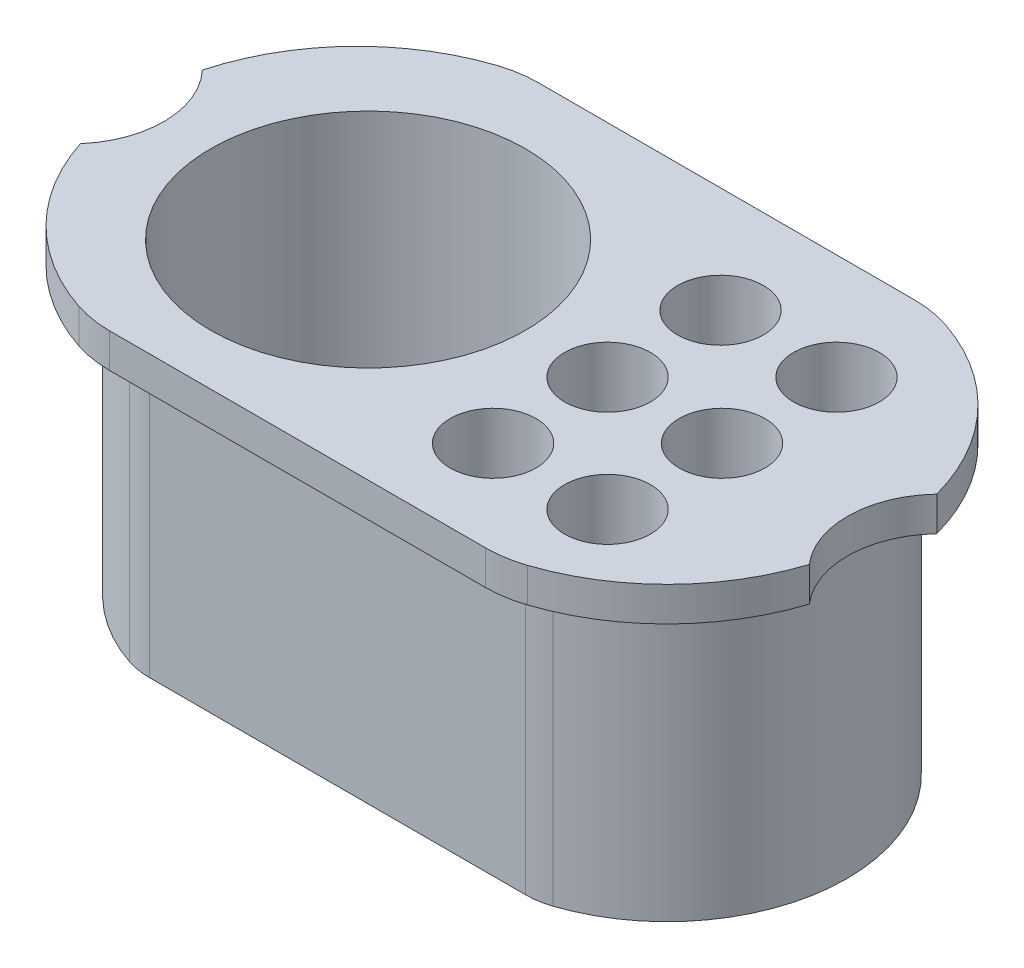
ISO-10303-21;
HEADER;
FILE_DESCRIPTION(('STEP AP214'),'2;1');
FILE_NAME('part.step','',(''),(''),'','','');
FILE_SCHEMA(('AUTOMOTIVE_DESIGN { 1 0 10303 214 1 1 1 1 }'));
ENDSEC;
DATA;
#1=APPLICATION_CONTEXT('core data for automotive mechanical design processes');
#2=APPLICATION_PROTOCOL_DEFINITION('international standard','automotive_design',2000,#1);
#3=PRODUCT_CONTEXT('',#1,'mechanical');
#4=PRODUCT('Part','Part','',(#3));
#5=PRODUCT_RELATED_PRODUCT_CATEGORY('part','',(#4));
#6=PRODUCT_DEFINITION_FORMATION('','',#4);
#7=PRODUCT_DEFINITION_CONTEXT('part definition',#1,'design');
#8=PRODUCT_DEFINITION('design','',#6,#7);
#9=PRODUCT_DEFINITION_SHAPE('','',#8);
#10=(LENGTH_UNIT() NAMED_UNIT(*) SI_UNIT(.MILLI.,.METRE.));
#11=(NAMED_UNIT(*) PLANE_ANGLE_UNIT() SI_UNIT($,.RADIAN.));
#12=(NAMED_UNIT(*) SI_UNIT($,.STERADIAN.) SOLID_ANGLE_UNIT());
#13=UNCERTAINTY_MEASURE_WITH_UNIT(LENGTH_MEASURE(1.E-05),#10,'distance_accuracy_value','');
#14=(GEOMETRIC_REPRESENTATION_CONTEXT(3) GLOBAL_UNCERTAINTY_ASSIGNED_CONTEXT((#13)) GLOBAL_UNIT_ASSIGNED_CONTEXT((#10,
#11,#12)) REPRESENTATION_CONTEXT('',''));
#15=CARTESIAN_POINT('',(0.,0.,0.));
#16=DIRECTION('',(0.,0.,1.));
#17=DIRECTION('',(1.,0.,0.));
#18=AXIS2_PLACEMENT_3D('',#15,#16,#17);
#19=CARTESIAN_POINT('',(-28.0219830583856,6.,-1.10913174767152));
#20=DIRECTION('',(0.,-1.,0.));
#21=DIRECTION('',(0.,0.,-1.));
#22=AXIS2_PLACEMENT_3D('',#19,#20,#21);
#23=CYLINDRICAL_SURFACE('',#22,38.4375);
#24=DIRECTION('',(0.,-1.,0.));
#25=VECTOR('',#24,1.);
#26=CARTESIAN_POINT('',(-65.1201453529565,5.,-11.1673503084143));
#27=LINE('',#26,#25);
#28=CARTESIAN_POINT('',(-65.1201453529565,6.,-11.1673503084143));
#29=VERTEX_POINT('',#28);
#30=CARTESIAN_POINT('',(-65.1201453529565,0.,-11.1673503084143));
#31=VERTEX_POINT('',#30);
#32=EDGE_CURVE('E450',#29,#31,#27,.T.);
#33=ORIENTED_EDGE('',*,*,#32,.F.);
#34=CARTESIAN_POINT('',(-28.0219830583856,6.,-1.10913174767152));
#35=DIRECTION('',(0.,1.,0.));
#36=DIRECTION('',(0.,0.,1.));
#37=AXIS2_PLACEMENT_3D('',#34,#35,#36);
#38=CIRCLE('',#37,38.4375);
#39=CARTESIAN_POINT('',(-40.1227436589354,6.,-37.5921825951292));
#40=VERTEX_POINT('',#39);
#41=EDGE_CURVE('E273',#40,#29,#38,.T.);
#42=ORIENTED_EDGE('',*,*,#41,.F.);
#43=DIRECTION('',(0.,-1.,0.));
#44=VECTOR('',#43,1.);
#45=CARTESIAN_POINT('',(-40.1227436589354,6.,-37.5921825951292));
#46=LINE('',#45,#44);
#47=CARTESIAN_POINT('',(-40.1227436589354,0.,-37.5921825951292));
#48=VERTEX_POINT('',#47);
#49=EDGE_CURVE('E242',#40,#48,#46,.T.);
#50=ORIENTED_EDGE('',*,*,#49,.T.);
#51=CARTESIAN_POINT('',(-28.0219830583856,0.,-1.10913174767152));
#52=DIRECTION('',(0.,1.,0.));
#53=DIRECTION('',(0.,0.,1.));
#54=AXIS2_PLACEMENT_3D('',#51,#52,#53);
#55=CIRCLE('',#54,38.4375);
#56=EDGE_CURVE('E260',#48,#31,#55,.T.);
#57=ORIENTED_EDGE('',*,*,#56,.T.);
#58=EDGE_LOOP('',(#33,#42,#50,#57));
#59=FACE_BOUND('',#58,.T.);
#60=ADVANCED_FACE('F33',(#59),#23,.T.);
#61=DIRECTION('',(0.,-1.,0.));
#62=VECTOR('',#61,1.);
#63=CARTESIAN_POINT('',(-64.6259224052166,5.,10.6208738168417));
#64=LINE('',#63,#62);
#65=CARTESIAN_POINT('',(-64.6259224052166,0.,10.6208738168417));
#66=VERTEX_POINT('',#65);
#67=CARTESIAN_POINT('',(-64.6259224052166,6.,10.6208738168417));
#68=VERTEX_POINT('',#67);
#69=EDGE_CURVE('E52',#66,#68,#64,.F.);
#70=ORIENTED_EDGE('',*,*,#69,.F.);
#71=CARTESIAN_POINT('',(-40.1227436589354,0.,35.3739190997861));
#72=VERTEX_POINT('',#71);
#73=EDGE_CURVE('E263',#66,#72,#55,.T.);
#74=ORIENTED_EDGE('',*,*,#73,.T.);
#75=DIRECTION('',(0.,-1.,0.));
#76=VECTOR('',#75,1.);
#77=CARTESIAN_POINT('',(-40.1227436589354,6.,35.3739190997861));
#78=LINE('',#77,#76);
#79=CARTESIAN_POINT('',(-40.1227436589354,6.,35.3739190997861));
#80=VERTEX_POINT('',#79);
#81=EDGE_CURVE('E245',#72,#80,#78,.F.);
#82=ORIENTED_EDGE('',*,*,#81,.T.);
#83=EDGE_CURVE('E252',#68,#80,#38,.T.);
#84=ORIENTED_EDGE('',*,*,#83,.F.);
#85=EDGE_LOOP('',(#70,#74,#82,#84));
#86=FACE_BOUND('',#85,.T.);
#87=ADVANCED_FACE('F567',(#86),#23,.T.);
#88=CARTESIAN_POINT('',(26.1030169416145,6.,-1.10913174767152));
#89=DIRECTION('',(0.,-1.,0.));
#90=DIRECTION('',(0.,0.,-1.));
#91=AXIS2_PLACEMENT_3D('',#88,#89,#90);
#92=CYLINDRICAL_SURFACE('',#91,38.4375);
#93=DIRECTION('',(0.,-1.,0.));
#94=VECTOR('',#93,1.);
#95=CARTESIAN_POINT('',(62.7069562884455,5.,10.6208738168417));
#96=LINE('',#95,#94);
#97=CARTESIAN_POINT('',(62.7069562884455,6.,10.6208738168417));
#98=VERTEX_POINT('',#97);
#99=CARTESIAN_POINT('',(62.7069562884455,0.,10.6208738168417));
#100=VERTEX_POINT('',#99);
#101=EDGE_CURVE('E443',#98,#100,#96,.T.);
#102=ORIENTED_EDGE('',*,*,#101,.F.);
#103=CARTESIAN_POINT('',(26.1030169416145,6.,-1.10913174767152));
#104=DIRECTION('',(0.,1.,0.));
#105=DIRECTION('',(0.,0.,-1.));
#106=AXIS2_PLACEMENT_3D('',#103,#104,#105);
#107=CIRCLE('',#106,38.4375);
#108=CARTESIAN_POINT('',(38.2037775421643,6.,35.3739190997861));
#109=VERTEX_POINT('',#108);
#110=EDGE_CURVE('E266',#109,#98,#107,.T.);
#111=ORIENTED_EDGE('',*,*,#110,.F.);
#112=DIRECTION('',(0.,-1.,0.));
#113=VECTOR('',#112,1.);
#114=CARTESIAN_POINT('',(38.2037775421643,6.,35.3739190997861));
#115=LINE('',#114,#113);
#116=CARTESIAN_POINT('',(38.2037775421643,0.,35.3739190997861));
#117=VERTEX_POINT('',#116);
#118=EDGE_CURVE('E208',#109,#117,#115,.T.);
#119=ORIENTED_EDGE('',*,*,#118,.T.);
#120=CARTESIAN_POINT('',(26.1030169416145,0.,-1.10913174767152));
#121=DIRECTION('',(0.,1.,0.));
#122=DIRECTION('',(0.,0.,-1.));
#123=AXIS2_PLACEMENT_3D('',#120,#121,#122);
#124=CIRCLE('',#123,38.4375);
#125=EDGE_CURVE('E253',#117,#100,#124,.T.);
#126=ORIENTED_EDGE('',*,*,#125,.T.);
#127=EDGE_LOOP('',(#102,#111,#119,#126));
#128=FACE_BOUND('',#127,.T.);
#129=ADVANCED_FACE('F550',(#128),#92,.T.);
#130=DIRECTION('',(0.,-1.,0.));
#131=VECTOR('',#130,1.);
#132=CARTESIAN_POINT('',(63.2011792361854,5.,-11.1673503084143));
#133=LINE('',#132,#131);
#134=CARTESIAN_POINT('',(63.2011792361854,0.,-11.1673503084143));
#135=VERTEX_POINT('',#134);
#136=CARTESIAN_POINT('',(63.2011792361854,6.,-11.1673503084143));
#137=VERTEX_POINT('',#136);
#138=EDGE_CURVE('E59',#135,#137,#133,.F.);
#139=ORIENTED_EDGE('',*,*,#138,.F.);
#140=CARTESIAN_POINT('',(38.2037775421643,0.,-37.5921825951292));
#141=VERTEX_POINT('',#140);
#142=EDGE_CURVE('E256',#135,#141,#124,.T.);
#143=ORIENTED_EDGE('',*,*,#142,.T.);
#144=DIRECTION('',(0.,-1.,0.));
#145=VECTOR('',#144,1.);
#146=CARTESIAN_POINT('',(38.2037775421643,6.,-37.5921825951292));
#147=LINE('',#146,#145);
#148=CARTESIAN_POINT('',(38.2037775421643,6.,-37.5921825951292));
#149=VERTEX_POINT('',#148);
#150=EDGE_CURVE('E211',#141,#149,#147,.F.);
#151=ORIENTED_EDGE('',*,*,#150,.T.);
#152=EDGE_CURVE('E269',#137,#149,#107,.T.);
#153=ORIENTED_EDGE('',*,*,#152,.F.);
#154=EDGE_LOOP('',(#139,#143,#151,#153));
#155=FACE_BOUND('',#154,.T.);
#156=ADVANCED_FACE('F545',(#155),#92,.T.);
#157=CARTESIAN_POINT('',(-28.0219830583856,0.,-1.10913174767152));
#158=DIRECTION('',(0.,1.,0.));
#159=DIRECTION('',(0.,0.,1.));
#160=AXIS2_PLACEMENT_3D('',#157,#158,#159);
#161=PLANE('',#160);
#162=CARTESIAN_POINT('',(-76.9189661167711,0.,0.));
#163=DIRECTION('',(0.,1.,0.));
#164=DIRECTION('',(0.,0.,-1.));
#165=AXIS2_PLACEMENT_3D('',#162,#163,#164);
#166=CIRCLE('',#165,16.2456727877753);
#167=EDGE_CURVE('E453',#66,#31,#166,.T.);
#168=ORIENTED_EDGE('',*,*,#167,.T.);
#169=ORIENTED_EDGE('',*,*,#56,.F.);
#170=CARTESIAN_POINT('',(-33.8264129399501,0.,-18.6091317476715));
#171=DIRECTION('',(0.,1.,0.));
#172=DIRECTION('',(0.,0.,1.));
#173=AXIS2_PLACEMENT_3D('',#170,#171,#172);
#174=CIRCLE('',#173,20.);
#175=CARTESIAN_POINT('',(-33.8264129399502,0.,-38.6091317476715));
#176=VERTEX_POINT('',#175);
#177=EDGE_CURVE('E232',#48,#176,#174,.F.);
#178=ORIENTED_EDGE('',*,*,#177,.T.);
#179=DIRECTION('',(-1.,0.,0.));
#180=VECTOR('',#179,1.);
#181=CARTESIAN_POINT('',(34.5405169416144,0.,-38.6091317476715));
#182=LINE('',#181,#180);
#183=CARTESIAN_POINT('',(31.907446823179,0.,-38.6091317476715));
#184=VERTEX_POINT('',#183);
#185=EDGE_CURVE('E249',#184,#176,#182,.T.);
#186=ORIENTED_EDGE('',*,*,#185,.F.);
#187=CARTESIAN_POINT('',(31.907446823179,0.,-18.6091317476715));
#188=DIRECTION('',(0.,1.,0.));
#189=DIRECTION('',(0.,0.,1.));
#190=AXIS2_PLACEMENT_3D('',#187,#188,#189);
#191=CIRCLE('',#190,20.);
#192=EDGE_CURVE('E239',#184,#141,#191,.F.);
#193=ORIENTED_EDGE('',*,*,#192,.T.);
#194=ORIENTED_EDGE('',*,*,#142,.F.);
#195=CARTESIAN_POINT('',(75.,0.,0.));
#196=DIRECTION('',(0.,1.,0.));
#197=DIRECTION('',(0.,0.,1.));
#198=AXIS2_PLACEMENT_3D('',#195,#196,#197);
#199=CIRCLE('',#198,16.2456727877753);
#200=EDGE_CURVE('E447',#135,#100,#199,.T.);
#201=ORIENTED_EDGE('',*,*,#200,.T.);
#202=ORIENTED_EDGE('',*,*,#125,.F.);
#203=CARTESIAN_POINT('',(31.907446823179,0.,16.3908682523285));
#204=DIRECTION('',(0.,1.,0.));
#205=DIRECTION('',(0.,0.,1.));
#206=AXIS2_PLACEMENT_3D('',#203,#204,#205);
#207=CIRCLE('',#206,20.);
#208=CARTESIAN_POINT('',(31.907446823179,0.,36.3908682523285));
#209=VERTEX_POINT('',#208);
#210=EDGE_CURVE('E237',#117,#209,#207,.F.);
#211=ORIENTED_EDGE('',*,*,#210,.T.);
#212=DIRECTION('',(1.,0.,0.));
#213=VECTOR('',#212,1.);
#214=CARTESIAN_POINT('',(34.5405169416144,0.,36.3908682523285));
#215=LINE('',#214,#213);
#216=CARTESIAN_POINT('',(-33.8264129399501,0.,36.3908682523285));
#217=VERTEX_POINT('',#216);
#218=EDGE_CURVE('E257',#217,#209,#215,.T.);
#219=ORIENTED_EDGE('',*,*,#218,.F.);
#220=CARTESIAN_POINT('',(-33.8264129399501,0.,16.3908682523285));
#221=DIRECTION('',(0.,1.,0.));
#222=DIRECTION('',(0.,0.,1.));
#223=AXIS2_PLACEMENT_3D('',#220,#221,#222);
#224=CIRCLE('',#223,20.);
#225=EDGE_CURVE('E234',#217,#72,#224,.F.);
#226=ORIENTED_EDGE('',*,*,#225,.T.);
#227=ORIENTED_EDGE('',*,*,#73,.F.);
#228=EDGE_LOOP('',(#168,#169,#178,#186,#193,#194,#201,#202,#211,#219,#226,#227));
#229=FACE_BOUND('',#228,.T.);
#230=CARTESIAN_POINT('',(31.907446823179,0.,-18.6091317476715));
#231=DIRECTION('',(0.,1.,0.));
#232=DIRECTION('',(0.,0.,1.));
#233=AXIS2_PLACEMENT_3D('',#230,#231,#232);
#234=CIRCLE('',#233,13.);
#235=CARTESIAN_POINT('',(36.0000617905195,0.,-30.948114798519));
#236=VERTEX_POINT('',#235);
#237=CARTESIAN_POINT('',(31.9074468231791,0.,-31.6091317476715));
#238=VERTEX_POINT('',#237);
#239=EDGE_CURVE('E204',#236,#238,#234,.T.);
#240=ORIENTED_EDGE('',*,*,#239,.T.);
#241=DIRECTION('',(1.,0.,0.));
#242=VECTOR('',#241,1.);
#243=CARTESIAN_POINT('',(-33.8264129399501,0.,-31.6091317476715));
#244=LINE('',#243,#242);
#245=CARTESIAN_POINT('',(-33.8264129399501,0.,-31.6091317476715));
#246=VERTEX_POINT('',#245);
#247=EDGE_CURVE('E278',#246,#238,#244,.T.);
#248=ORIENTED_EDGE('',*,*,#247,.F.);
#249=CARTESIAN_POINT('',(-33.8264129399501,0.,-18.6091317476715));
#250=DIRECTION('',(0.,1.,0.));
#251=DIRECTION('',(0.,0.,1.));
#252=AXIS2_PLACEMENT_3D('',#249,#250,#251);
#253=CIRCLE('',#252,13.);
#254=CARTESIAN_POINT('',(-37.9190279072906,0.,-30.948114798519));
#255=VERTEX_POINT('',#254);
#256=EDGE_CURVE('E367',#246,#255,#253,.T.);
#257=ORIENTED_EDGE('',*,*,#256,.T.);
#258=CARTESIAN_POINT('',(-28.0219830583856,0.,-1.10913174767152));
#259=DIRECTION('',(0.,1.,0.));
#260=DIRECTION('',(0.,0.,1.));
#261=AXIS2_PLACEMENT_3D('',#258,#259,#260);
#262=CIRCLE('',#261,31.4375);
#263=CARTESIAN_POINT('',(-37.9190279072906,0.,28.7298513031759));
#264=VERTEX_POINT('',#263);
#265=EDGE_CURVE('E381',#255,#264,#262,.T.);
#266=ORIENTED_EDGE('',*,*,#265,.T.);
#267=CARTESIAN_POINT('',(-33.8264129399501,0.,16.3908682523285));
#268=DIRECTION('',(0.,1.,0.));
#269=DIRECTION('',(0.,0.,1.));
#270=AXIS2_PLACEMENT_3D('',#267,#268,#269);
#271=CIRCLE('',#270,13.);
#272=CARTESIAN_POINT('',(-33.8264129399502,0.,29.3908682523285));
#273=VERTEX_POINT('',#272);
#274=EDGE_CURVE('E393',#264,#273,#271,.T.);
#275=ORIENTED_EDGE('',*,*,#274,.T.);
#276=DIRECTION('',(1.,0.,0.));
#277=VECTOR('',#276,1.);
#278=CARTESIAN_POINT('',(-33.8264129399502,0.,29.3908682523285));
#279=LINE('',#278,#277);
#280=CARTESIAN_POINT('',(31.907446823179,0.,29.3908682523285));
#281=VERTEX_POINT('',#280);
#282=EDGE_CURVE('E405',#273,#281,#279,.T.);
#283=ORIENTED_EDGE('',*,*,#282,.T.);
#284=CARTESIAN_POINT('',(31.907446823179,0.,16.3908682523285));
#285=DIRECTION('',(0.,1.,0.));
#286=DIRECTION('',(0.,0.,1.));
#287=AXIS2_PLACEMENT_3D('',#284,#285,#286);
#288=CIRCLE('',#287,13.);
#289=CARTESIAN_POINT('',(36.0000617905195,0.,28.7298513031759));
#290=VERTEX_POINT('',#289);
#291=EDGE_CURVE('E417',#281,#290,#288,.T.);
#292=ORIENTED_EDGE('',*,*,#291,.T.);
#293=CARTESIAN_POINT('',(26.1030169416145,0.,-1.10913174767152));
#294=DIRECTION('',(0.,1.,0.));
#295=DIRECTION('',(0.,0.,1.));
#296=AXIS2_PLACEMENT_3D('',#293,#294,#295);
#297=CIRCLE('',#296,31.4375);
#298=EDGE_CURVE('E429',#290,#236,#297,.T.);
#299=ORIENTED_EDGE('',*,*,#298,.T.);
#300=EDGE_LOOP('',(#240,#248,#257,#266,#275,#283,#292,#299));
#301=FACE_BOUND('',#300,.T.);
#302=ADVANCED_FACE('F439',(#229,#301),#161,.F.);
#303=CARTESIAN_POINT('',(34.5405169416144,6.,36.3908682523285));
#304=DIRECTION('',(0.,0.,-1.));
#305=DIRECTION('',(-1.,0.,0.));
#306=AXIS2_PLACEMENT_3D('',#303,#304,#305);
#307=PLANE('',#306);
#308=DIRECTION('',(1.,0.,0.));
#309=VECTOR('',#308,1.);
#310=CARTESIAN_POINT('',(34.5405169416144,6.,36.3908682523285));
#311=LINE('',#310,#309);
#312=CARTESIAN_POINT('',(-33.8264129399501,6.,36.3908682523285));
#313=VERTEX_POINT('',#312);
#314=CARTESIAN_POINT('',(31.907446823179,6.,36.3908682523285));
#315=VERTEX_POINT('',#314);
#316=EDGE_CURVE('E270',#313,#315,#311,.T.);
#317=ORIENTED_EDGE('',*,*,#316,.F.);
#318=DIRECTION('',(0.,-1.,0.));
#319=VECTOR('',#318,1.);
#320=CARTESIAN_POINT('',(-33.8264129399501,6.,36.3908682523285));
#321=LINE('',#320,#319);
#322=EDGE_CURVE('E214',#313,#217,#321,.T.);
#323=ORIENTED_EDGE('',*,*,#322,.T.);
#324=ORIENTED_EDGE('',*,*,#218,.T.);
#325=DIRECTION('',(0.,-1.,0.));
#326=VECTOR('',#325,1.);
#327=CARTESIAN_POINT('',(31.907446823179,6.,36.3908682523285));
#328=LINE('',#327,#326);
#329=EDGE_CURVE('E217',#209,#315,#328,.F.);
#330=ORIENTED_EDGE('',*,*,#329,.T.);
#331=EDGE_LOOP('',(#317,#323,#324,#330));
#332=FACE_BOUND('',#331,.T.);
#333=ADVANCED_FACE('F557',(#332),#307,.F.);
#334=CARTESIAN_POINT('',(34.5405169416144,6.,-38.6091317476715));
#335=DIRECTION('',(0.,0.,1.));
#336=DIRECTION('',(1.,0.,0.));
#337=AXIS2_PLACEMENT_3D('',#334,#335,#336);
#338=PLANE('',#337);
#339=ORIENTED_EDGE('',*,*,#185,.T.);
#340=DIRECTION('',(0.,-1.,0.));
#341=VECTOR('',#340,1.);
#342=CARTESIAN_POINT('',(-33.8264129399502,6.,-38.6091317476715));
#343=LINE('',#342,#341);
#344=CARTESIAN_POINT('',(-33.8264129399502,6.,-38.6091317476715));
#345=VERTEX_POINT('',#344);
#346=EDGE_CURVE('E227',#176,#345,#343,.F.);
#347=ORIENTED_EDGE('',*,*,#346,.T.);
#348=DIRECTION('',(-1.,0.,0.));
#349=VECTOR('',#348,1.);
#350=CARTESIAN_POINT('',(34.5405169416144,6.,-38.6091317476715));
#351=LINE('',#350,#349);
#352=CARTESIAN_POINT('',(31.907446823179,6.,-38.6091317476715));
#353=VERTEX_POINT('',#352);
#354=EDGE_CURVE('E248',#353,#345,#351,.T.);
#355=ORIENTED_EDGE('',*,*,#354,.F.);
#356=DIRECTION('',(0.,-1.,0.));
#357=VECTOR('',#356,1.);
#358=CARTESIAN_POINT('',(31.907446823179,6.,-38.6091317476715));
#359=LINE('',#358,#357);
#360=EDGE_CURVE('E229',#353,#184,#359,.T.);
#361=ORIENTED_EDGE('',*,*,#360,.T.);
#362=EDGE_LOOP('',(#339,#347,#355,#361));
#363=FACE_BOUND('',#362,.T.);
#364=ADVANCED_FACE('F512',(#363),#338,.F.);
#365=CARTESIAN_POINT('',(-28.0219830583856,6.,-1.10913174767152));
#366=DIRECTION('',(0.,1.,0.));
#367=DIRECTION('',(0.,0.,1.));
#368=AXIS2_PLACEMENT_3D('',#365,#366,#367);
#369=PLANE('',#368);
#370=CARTESIAN_POINT('',(36.7481952476588,6.,-20.0933036744728));
#371=DIRECTION('',(0.,1.,0.));
#372=DIRECTION('',(0.,0.,1.));
#373=AXIS2_PLACEMENT_3D('',#370,#371,#372);
#374=CIRCLE('',#373,7.5);
#375=CARTESIAN_POINT('',(36.7481952476588,6.,-12.5933036744728));
#376=VERTEX_POINT('',#375);
#377=EDGE_CURVE('E493',#376,#376,#374,.T.);
#378=ORIENTED_EDGE('',*,*,#377,.F.);
#379=EDGE_LOOP('',(#378));
#380=FACE_BOUND('',#379,.T.);
#381=CARTESIAN_POINT('',(36.7481952476588,6.,19.9066963255272));
#382=DIRECTION('',(0.,1.,0.));
#383=DIRECTION('',(0.,0.,1.));
#384=AXIS2_PLACEMENT_3D('',#381,#382,#383);
#385=CIRCLE('',#384,7.5);
#386=CARTESIAN_POINT('',(36.7481952476588,6.,27.4066963255272));
#387=VERTEX_POINT('',#386);
#388=EDGE_CURVE('E487',#387,#387,#385,.T.);
#389=ORIENTED_EDGE('',*,*,#388,.F.);
#390=EDGE_LOOP('',(#389));
#391=FACE_BOUND('',#390,.T.);
#392=CARTESIAN_POINT('',(16.4862682542421,6.,-20.0915884571765));
#393=DIRECTION('',(0.,1.,0.));
#394=DIRECTION('',(0.,0.,-1.));
#395=AXIS2_PLACEMENT_3D('',#392,#393,#394);
#396=CIRCLE('',#395,7.49999999999999);
#397=CARTESIAN_POINT('',(16.4862682542421,6.,-27.5915884571765));
#398=VERTEX_POINT('',#397);
#399=EDGE_CURVE('E481',#398,#398,#396,.T.);
#400=ORIENTED_EDGE('',*,*,#399,.F.);
#401=EDGE_LOOP('',(#400));
#402=FACE_BOUND('',#401,.T.);
#403=CARTESIAN_POINT('',(16.7481952476588,6.,19.9066963255272));
#404=DIRECTION('',(0.,1.,0.));
#405=DIRECTION('',(0.,0.,1.));
#406=AXIS2_PLACEMENT_3D('',#403,#404,#405);
#407=CIRCLE('',#406,7.5);
#408=CARTESIAN_POINT('',(16.7481952476588,6.,27.4066963255272));
#409=VERTEX_POINT('',#408);
#410=EDGE_CURVE('E475',#409,#409,#407,.T.);
#411=ORIENTED_EDGE('',*,*,#410,.F.);
#412=EDGE_LOOP('',(#411));
#413=FACE_BOUND('',#412,.T.);
#414=CARTESIAN_POINT('',(16.7481952476588,6.,-0.0933036744727601));
#415=DIRECTION('',(0.,1.,0.));
#416=DIRECTION('',(0.,0.,1.));
#417=AXIS2_PLACEMENT_3D('',#414,#415,#416);
#418=CIRCLE('',#417,7.5);
#419=CARTESIAN_POINT('',(16.7481952476588,6.,7.40669632552724));
#420=VERTEX_POINT('',#419);
#421=EDGE_CURVE('E469',#420,#420,#418,.T.);
#422=ORIENTED_EDGE('',*,*,#421,.F.);
#423=EDGE_LOOP('',(#422));
#424=FACE_BOUND('',#423,.T.);
#425=CARTESIAN_POINT('',(36.7481952476588,6.,-0.0933036744727601));
#426=DIRECTION('',(0.,1.,0.));
#427=DIRECTION('',(0.,0.,1.));
#428=AXIS2_PLACEMENT_3D('',#425,#426,#427);
#429=CIRCLE('',#428,7.5);
#430=CARTESIAN_POINT('',(36.7481952476588,6.,7.40669632552724));
#431=VERTEX_POINT('',#430);
#432=EDGE_CURVE('E463',#431,#431,#429,.T.);
#433=ORIENTED_EDGE('',*,*,#432,.F.);
#434=EDGE_LOOP('',(#433));
#435=FACE_BOUND('',#434,.T.);
#436=CARTESIAN_POINT('',(-25.,6.,0.));
#437=DIRECTION('',(0.,1.,0.));
#438=DIRECTION('',(0.,0.,1.));
#439=AXIS2_PLACEMENT_3D('',#436,#437,#438);
#440=CIRCLE('',#439,27.5);
#441=CARTESIAN_POINT('',(-25.,6.,27.5));
#442=VERTEX_POINT('',#441);
#443=EDGE_CURVE('E457',#442,#442,#440,.T.);
#444=ORIENTED_EDGE('',*,*,#443,.F.);
#445=EDGE_LOOP('',(#444));
#446=FACE_BOUND('',#445,.T.);
#447=ORIENTED_EDGE('',*,*,#41,.T.);
#448=CARTESIAN_POINT('',(-76.9189661167711,6.,0.));
#449=DIRECTION('',(0.,1.,0.));
#450=DIRECTION('',(0.,0.,1.));
#451=AXIS2_PLACEMENT_3D('',#448,#449,#450);
#452=CIRCLE('',#451,16.2456727877753);
#453=EDGE_CURVE('E11',#29,#68,#452,.F.);
#454=ORIENTED_EDGE('',*,*,#453,.T.);
#455=ORIENTED_EDGE('',*,*,#83,.T.);
#456=CARTESIAN_POINT('',(-33.8264129399501,6.,16.3908682523285));
#457=DIRECTION('',(0.,1.,0.));
#458=DIRECTION('',(0.,0.,1.));
#459=AXIS2_PLACEMENT_3D('',#456,#457,#458);
#460=CIRCLE('',#459,20.);
#461=EDGE_CURVE('E221',#80,#313,#460,.T.);
#462=ORIENTED_EDGE('',*,*,#461,.T.);
#463=ORIENTED_EDGE('',*,*,#316,.T.);
#464=CARTESIAN_POINT('',(31.907446823179,6.,16.3908682523285));
#465=DIRECTION('',(0.,1.,0.));
#466=DIRECTION('',(0.,0.,1.));
#467=AXIS2_PLACEMENT_3D('',#464,#465,#466);
#468=CIRCLE('',#467,20.);
#469=EDGE_CURVE('E223',#315,#109,#468,.T.);
#470=ORIENTED_EDGE('',*,*,#469,.T.);
#471=ORIENTED_EDGE('',*,*,#110,.T.);
#472=CARTESIAN_POINT('',(75.,6.,0.));
#473=DIRECTION('',(0.,1.,0.));
#474=DIRECTION('',(0.,0.,1.));
#475=AXIS2_PLACEMENT_3D('',#472,#473,#474);
#476=CIRCLE('',#475,16.2456727877753);
#477=EDGE_CURVE('E44',#98,#137,#476,.F.);
#478=ORIENTED_EDGE('',*,*,#477,.T.);
#479=ORIENTED_EDGE('',*,*,#152,.T.);
#480=CARTESIAN_POINT('',(31.907446823179,6.,-18.6091317476715));
#481=DIRECTION('',(0.,1.,0.));
#482=DIRECTION('',(0.,0.,1.));
#483=AXIS2_PLACEMENT_3D('',#480,#481,#482);
#484=CIRCLE('',#483,20.);
#485=EDGE_CURVE('E225',#149,#353,#484,.T.);
#486=ORIENTED_EDGE('',*,*,#485,.T.);
#487=ORIENTED_EDGE('',*,*,#354,.T.);
#488=CARTESIAN_POINT('',(-33.8264129399501,6.,-18.6091317476715));
#489=DIRECTION('',(0.,1.,0.));
#490=DIRECTION('',(0.,0.,1.));
#491=AXIS2_PLACEMENT_3D('',#488,#489,#490);
#492=CIRCLE('',#491,20.);
#493=EDGE_CURVE('E219',#345,#40,#492,.T.);
#494=ORIENTED_EDGE('',*,*,#493,.T.);
#495=EDGE_LOOP('',(#447,#454,#455,#462,#463,#470,#471,#478,#479,#486,#487,#494));
#496=FACE_BOUND('',#495,.T.);
#497=ADVANCED_FACE('F508',(#380,#391,#402,#413,#424,#435,#446,#496),#369,.T.);
#498=CARTESIAN_POINT('',(-33.8264129399501,6.,-18.6091317476715));
#499=DIRECTION('',(0.,-1.,0.));
#500=DIRECTION('',(0.,0.,-1.));
#501=AXIS2_PLACEMENT_3D('',#498,#499,#500);
#502=CYLINDRICAL_SURFACE('',#501,20.);
#503=ORIENTED_EDGE('',*,*,#493,.F.);
#504=ORIENTED_EDGE('',*,*,#346,.F.);
#505=ORIENTED_EDGE('',*,*,#177,.F.);
#506=ORIENTED_EDGE('',*,*,#49,.F.);
#507=EDGE_LOOP('',(#503,#504,#505,#506));
#508=FACE_BOUND('',#507,.T.);
#509=ADVANCED_FACE('F511',(#508),#502,.T.);
#510=CARTESIAN_POINT('',(-33.8264129399501,6.,16.3908682523285));
#511=DIRECTION('',(0.,-1.,0.));
#512=DIRECTION('',(0.,0.,-1.));
#513=AXIS2_PLACEMENT_3D('',#510,#511,#512);
#514=CYLINDRICAL_SURFACE('',#513,20.);
#515=ORIENTED_EDGE('',*,*,#461,.F.);
#516=ORIENTED_EDGE('',*,*,#81,.F.);
#517=ORIENTED_EDGE('',*,*,#225,.F.);
#518=ORIENTED_EDGE('',*,*,#322,.F.);
#519=EDGE_LOOP('',(#515,#516,#517,#518));
#520=FACE_BOUND('',#519,.T.);
#521=ADVANCED_FACE('F563',(#520),#514,.T.);
#522=CARTESIAN_POINT('',(31.907446823179,6.,16.3908682523285));
#523=DIRECTION('',(0.,-1.,0.));
#524=DIRECTION('',(0.,0.,-1.));
#525=AXIS2_PLACEMENT_3D('',#522,#523,#524);
#526=CYLINDRICAL_SURFACE('',#525,20.);
#527=ORIENTED_EDGE('',*,*,#469,.F.);
#528=ORIENTED_EDGE('',*,*,#329,.F.);
#529=ORIENTED_EDGE('',*,*,#210,.F.);
#530=ORIENTED_EDGE('',*,*,#118,.F.);
#531=EDGE_LOOP('',(#527,#528,#529,#530));
#532=FACE_BOUND('',#531,.T.);
#533=ADVANCED_FACE('F560',(#532),#526,.T.);
#534=CARTESIAN_POINT('',(31.907446823179,6.,-18.6091317476715));
#535=DIRECTION('',(0.,-1.,0.));
#536=DIRECTION('',(0.,0.,-1.));
#537=AXIS2_PLACEMENT_3D('',#534,#535,#536);
#538=CYLINDRICAL_SURFACE('',#537,20.);
#539=ORIENTED_EDGE('',*,*,#485,.F.);
#540=ORIENTED_EDGE('',*,*,#150,.F.);
#541=ORIENTED_EDGE('',*,*,#192,.F.);
#542=ORIENTED_EDGE('',*,*,#360,.F.);
#543=EDGE_LOOP('',(#539,#540,#541,#542));
#544=FACE_BOUND('',#543,.T.);
#545=ADVANCED_FACE('F35',(#544),#538,.T.);
#546=CARTESIAN_POINT('',(36.0000617905195,-50.,-30.948114798519));
#547=DIRECTION('',(0.,1.,0.));
#548=DIRECTION('',(0.,0.,1.));
#549=AXIS2_PLACEMENT_3D('',#546,#547,#548);
#550=PLANE('',#549);
#551=CARTESIAN_POINT('',(31.907446823179,-50.,-18.6091317476715));
#552=DIRECTION('',(0.,1.,0.));
#553=DIRECTION('',(0.,0.,1.));
#554=AXIS2_PLACEMENT_3D('',#551,#552,#553);
#555=CIRCLE('',#554,13.);
#556=CARTESIAN_POINT('',(36.0000617905195,-50.,-30.948114798519));
#557=VERTEX_POINT('',#556);
#558=CARTESIAN_POINT('',(31.907446823179,-50.,-31.6091317476715));
#559=VERTEX_POINT('',#558);
#560=EDGE_CURVE('E336',#557,#559,#555,.T.);
#561=ORIENTED_EDGE('',*,*,#560,.F.);
#562=CARTESIAN_POINT('',(26.1030169416145,-50.,-1.10913174767152));
#563=DIRECTION('',(0.,1.,0.));
#564=DIRECTION('',(0.,0.,1.));
#565=AXIS2_PLACEMENT_3D('',#562,#563,#564);
#566=CIRCLE('',#565,31.4375);
#567=CARTESIAN_POINT('',(36.0000617905195,-50.,28.7298513031759));
#568=VERTEX_POINT('',#567);
#569=EDGE_CURVE('E431',#568,#557,#566,.T.);
#570=ORIENTED_EDGE('',*,*,#569,.F.);
#571=CARTESIAN_POINT('',(31.907446823179,-50.,16.3908682523285));
#572=DIRECTION('',(0.,1.,0.));
#573=DIRECTION('',(0.,0.,1.));
#574=AXIS2_PLACEMENT_3D('',#571,#572,#573);
#575=CIRCLE('',#574,13.);
#576=CARTESIAN_POINT('',(31.907446823179,-50.,29.3908682523285));
#577=VERTEX_POINT('',#576);
#578=EDGE_CURVE('E420',#577,#568,#575,.T.);
#579=ORIENTED_EDGE('',*,*,#578,.F.);
#580=DIRECTION('',(1.,0.,0.));
#581=VECTOR('',#580,1.);
#582=CARTESIAN_POINT('',(-33.8264129399501,-50.,29.3908682523285));
#583=LINE('',#582,#581);
#584=CARTESIAN_POINT('',(-33.8264129399501,-50.,29.3908682523285));
#585=VERTEX_POINT('',#584);
#586=EDGE_CURVE('E408',#585,#577,#583,.T.);
#587=ORIENTED_EDGE('',*,*,#586,.F.);
#588=CARTESIAN_POINT('',(-33.8264129399501,-50.,16.3908682523285));
#589=DIRECTION('',(0.,1.,0.));
#590=DIRECTION('',(0.,0.,1.));
#591=AXIS2_PLACEMENT_3D('',#588,#589,#590);
#592=CIRCLE('',#591,13.);
#593=CARTESIAN_POINT('',(-37.9190279072906,-50.,28.7298513031759));
#594=VERTEX_POINT('',#593);
#595=EDGE_CURVE('E396',#594,#585,#592,.T.);
#596=ORIENTED_EDGE('',*,*,#595,.F.);
#597=CARTESIAN_POINT('',(-28.0219830583856,-50.,-1.10913174767152));
#598=DIRECTION('',(0.,1.,0.));
#599=DIRECTION('',(0.,0.,1.));
#600=AXIS2_PLACEMENT_3D('',#597,#598,#599);
#601=CIRCLE('',#600,31.4375);
#602=CARTESIAN_POINT('',(-37.9190279072906,-50.,-30.948114798519));
#603=VERTEX_POINT('',#602);
#604=EDGE_CURVE('E384',#603,#594,#601,.T.);
#605=ORIENTED_EDGE('',*,*,#604,.F.);
#606=CARTESIAN_POINT('',(-33.8264129399501,-50.,-18.6091317476715));
#607=DIRECTION('',(0.,1.,0.));
#608=DIRECTION('',(0.,0.,1.));
#609=AXIS2_PLACEMENT_3D('',#606,#607,#608);
#610=CIRCLE('',#609,13.);
#611=CARTESIAN_POINT('',(-33.8264129399501,-50.,-31.6091317476715));
#612=VERTEX_POINT('',#611);
#613=EDGE_CURVE('E373',#612,#603,#610,.T.);
#614=ORIENTED_EDGE('',*,*,#613,.F.);
#615=DIRECTION('',(1.,0.,0.));
#616=VECTOR('',#615,1.);
#617=CARTESIAN_POINT('',(-33.8264129399501,-50.,-31.6091317476715));
#618=LINE('',#617,#616);
#619=EDGE_CURVE('E203',#612,#559,#618,.T.);
#620=ORIENTED_EDGE('',*,*,#619,.T.);
#621=EDGE_LOOP('',(#561,#570,#579,#587,#596,#605,#614,#620));
#622=FACE_BOUND('',#621,.T.);
#623=ADVANCED_FACE('F198',(#622),#550,.F.);
#624=CARTESIAN_POINT('',(31.907446823179,0.,-18.6091317476715));
#625=DIRECTION('',(0.,1.,0.));
#626=DIRECTION('',(0.,0.,1.));
#627=AXIS2_PLACEMENT_3D('',#624,#625,#626);
#628=CYLINDRICAL_SURFACE('',#627,13.);
#629=DIRECTION('',(0.,1.,0.));
#630=VECTOR('',#629,1.);
#631=CARTESIAN_POINT('',(36.0000617905195,0.,-30.948114798519));
#632=LINE('',#631,#630);
#633=EDGE_CURVE('E423',#557,#236,#632,.T.);
#634=ORIENTED_EDGE('',*,*,#633,.F.);
#635=ORIENTED_EDGE('',*,*,#560,.T.);
#636=CARTESIAN_POINT('',(31.9074468231791,-50.,-31.6091317476715));
#637=DIRECTION('',(0.,1.,0.));
#638=VECTOR('',#637,1.);
#639=LINE('',#636,#638);
#640=EDGE_CURVE('E205',#559,#238,#639,.T.);
#641=ORIENTED_EDGE('',*,*,#640,.T.);
#642=ORIENTED_EDGE('',*,*,#239,.F.);
#643=EDGE_LOOP('',(#634,#635,#641,#642));
#644=FACE_BOUND('',#643,.T.);
#645=ADVANCED_FACE('F323',(#644),#628,.T.);
#646=CARTESIAN_POINT('',(26.1030169416145,0.,-1.10913174767152));
#647=DIRECTION('',(0.,1.,0.));
#648=DIRECTION('',(0.,0.,1.));
#649=AXIS2_PLACEMENT_3D('',#646,#647,#648);
#650=CYLINDRICAL_SURFACE('',#649,31.4375);
#651=DIRECTION('',(0.,1.,0.));
#652=VECTOR('',#651,1.);
#653=CARTESIAN_POINT('',(36.0000617905195,0.,28.7298513031759));
#654=LINE('',#653,#652);
#655=EDGE_CURVE('E411',#568,#290,#654,.T.);
#656=ORIENTED_EDGE('',*,*,#655,.F.);
#657=ORIENTED_EDGE('',*,*,#569,.T.);
#658=ORIENTED_EDGE('',*,*,#633,.T.);
#659=ORIENTED_EDGE('',*,*,#298,.F.);
#660=EDGE_LOOP('',(#656,#657,#658,#659));
#661=FACE_BOUND('',#660,.T.);
#662=ADVANCED_FACE('F319',(#661),#650,.T.);
#663=CARTESIAN_POINT('',(31.907446823179,0.,16.3908682523285));
#664=DIRECTION('',(0.,1.,0.));
#665=DIRECTION('',(0.,0.,1.));
#666=AXIS2_PLACEMENT_3D('',#663,#664,#665);
#667=CYLINDRICAL_SURFACE('',#666,13.);
#668=DIRECTION('',(0.,1.,0.));
#669=VECTOR('',#668,1.);
#670=CARTESIAN_POINT('',(31.907446823179,0.,29.3908682523285));
#671=LINE('',#670,#669);
#672=EDGE_CURVE('E399',#577,#281,#671,.T.);
#673=ORIENTED_EDGE('',*,*,#672,.F.);
#674=ORIENTED_EDGE('',*,*,#578,.T.);
#675=ORIENTED_EDGE('',*,*,#655,.T.);
#676=ORIENTED_EDGE('',*,*,#291,.F.);
#677=EDGE_LOOP('',(#673,#674,#675,#676));
#678=FACE_BOUND('',#677,.T.);
#679=ADVANCED_FACE('F315',(#678),#667,.T.);
#680=CARTESIAN_POINT('',(-33.8264129399502,0.,29.3908682523285));
#681=DIRECTION('',(0.,0.,-1.));
#682=DIRECTION('',(0.,1.,0.));
#683=AXIS2_PLACEMENT_3D('',#680,#681,#682);
#684=PLANE('',#683);
#685=DIRECTION('',(0.,1.,0.));
#686=VECTOR('',#685,1.);
#687=CARTESIAN_POINT('',(-33.8264129399502,0.,29.3908682523285));
#688=LINE('',#687,#686);
#689=EDGE_CURVE('E387',#585,#273,#688,.T.);
#690=ORIENTED_EDGE('',*,*,#689,.F.);
#691=ORIENTED_EDGE('',*,*,#586,.T.);
#692=ORIENTED_EDGE('',*,*,#672,.T.);
#693=ORIENTED_EDGE('',*,*,#282,.F.);
#694=EDGE_LOOP('',(#690,#691,#692,#693));
#695=FACE_BOUND('',#694,.T.);
#696=ADVANCED_FACE('F311',(#695),#684,.F.);
#697=CARTESIAN_POINT('',(-33.8264129399501,0.,16.3908682523285));
#698=DIRECTION('',(0.,1.,0.));
#699=DIRECTION('',(0.,0.,1.));
#700=AXIS2_PLACEMENT_3D('',#697,#698,#699);
#701=CYLINDRICAL_SURFACE('',#700,13.);
#702=DIRECTION('',(0.,1.,0.));
#703=VECTOR('',#702,1.);
#704=CARTESIAN_POINT('',(-37.9190279072906,0.,28.7298513031759));
#705=LINE('',#704,#703);
#706=EDGE_CURVE('E375',#594,#264,#705,.T.);
#707=ORIENTED_EDGE('',*,*,#706,.F.);
#708=ORIENTED_EDGE('',*,*,#595,.T.);
#709=ORIENTED_EDGE('',*,*,#689,.T.);
#710=ORIENTED_EDGE('',*,*,#274,.F.);
#711=EDGE_LOOP('',(#707,#708,#709,#710));
#712=FACE_BOUND('',#711,.T.);
#713=ADVANCED_FACE('F307',(#712),#701,.T.);
#714=CARTESIAN_POINT('',(-28.0219830583856,0.,-1.10913174767152));
#715=DIRECTION('',(0.,1.,0.));
#716=DIRECTION('',(0.,0.,1.));
#717=AXIS2_PLACEMENT_3D('',#714,#715,#716);
#718=CYLINDRICAL_SURFACE('',#717,31.4375);
#719=DIRECTION('',(0.,1.,0.));
#720=VECTOR('',#719,1.);
#721=CARTESIAN_POINT('',(-37.9190279072906,0.,-30.948114798519));
#722=LINE('',#721,#720);
#723=EDGE_CURVE('E357',#603,#255,#722,.T.);
#724=ORIENTED_EDGE('',*,*,#723,.F.);
#725=ORIENTED_EDGE('',*,*,#604,.T.);
#726=ORIENTED_EDGE('',*,*,#706,.T.);
#727=ORIENTED_EDGE('',*,*,#265,.F.);
#728=EDGE_LOOP('',(#724,#725,#726,#727));
#729=FACE_BOUND('',#728,.T.);
#730=ADVANCED_FACE('F303',(#729),#718,.T.);
#731=CARTESIAN_POINT('',(-33.8264129399501,0.,-18.6091317476715));
#732=DIRECTION('',(0.,1.,0.));
#733=DIRECTION('',(0.,0.,1.));
#734=AXIS2_PLACEMENT_3D('',#731,#732,#733);
#735=CYLINDRICAL_SURFACE('',#734,13.);
#736=DIRECTION('',(0.,1.,0.));
#737=VECTOR('',#736,1.);
#738=CARTESIAN_POINT('',(-33.8264129399501,0.,-31.6091317476715));
#739=LINE('',#738,#737);
#740=EDGE_CURVE('E437',#612,#246,#739,.T.);
#741=ORIENTED_EDGE('',*,*,#740,.F.);
#742=ORIENTED_EDGE('',*,*,#613,.T.);
#743=ORIENTED_EDGE('',*,*,#723,.T.);
#744=ORIENTED_EDGE('',*,*,#256,.F.);
#745=EDGE_LOOP('',(#741,#742,#743,#744));
#746=FACE_BOUND('',#745,.T.);
#747=ADVANCED_FACE('F298',(#746),#735,.T.);
#748=CARTESIAN_POINT('',(-33.8264129399501,0.,-31.6091317476715));
#749=DIRECTION('',(0.,0.,-1.));
#750=DIRECTION('',(0.,1.,0.));
#751=AXIS2_PLACEMENT_3D('',#748,#749,#750);
#752=PLANE('',#751);
#753=ORIENTED_EDGE('',*,*,#640,.F.);
#754=ORIENTED_EDGE('',*,*,#619,.F.);
#755=ORIENTED_EDGE('',*,*,#740,.T.);
#756=ORIENTED_EDGE('',*,*,#247,.T.);
#757=EDGE_LOOP('',(#753,#754,#755,#756));
#758=FACE_BOUND('',#757,.T.);
#759=ADVANCED_FACE('F287',(#758),#752,.T.);
#760=CARTESIAN_POINT('',(75.,10.,0.));
#761=DIRECTION('',(0.,-1.,0.));
#762=DIRECTION('',(0.,0.,-1.));
#763=AXIS2_PLACEMENT_3D('',#760,#761,#762);
#764=CYLINDRICAL_SURFACE('',#763,16.2456727877753);
#765=ORIENTED_EDGE('',*,*,#101,.T.);
#766=ORIENTED_EDGE('',*,*,#200,.F.);
#767=ORIENTED_EDGE('',*,*,#138,.T.);
#768=ORIENTED_EDGE('',*,*,#477,.F.);
#769=EDGE_LOOP('',(#765,#766,#767,#768));
#770=FACE_BOUND('',#769,.T.);
#771=ADVANCED_FACE('F297',(#770),#764,.F.);
#772=CARTESIAN_POINT('',(-76.9189661167711,10.,0.));
#773=DIRECTION('',(0.,-1.,0.));
#774=DIRECTION('',(0.,0.,-1.));
#775=AXIS2_PLACEMENT_3D('',#772,#773,#774);
#776=CYLINDRICAL_SURFACE('',#775,16.2456727877753);
#777=ORIENTED_EDGE('',*,*,#32,.T.);
#778=ORIENTED_EDGE('',*,*,#167,.F.);
#779=ORIENTED_EDGE('',*,*,#69,.T.);
#780=ORIENTED_EDGE('',*,*,#453,.F.);
#781=EDGE_LOOP('',(#777,#778,#779,#780));
#782=FACE_BOUND('',#781,.T.);
#783=ADVANCED_FACE('F630',(#782),#776,.F.);
#784=CARTESIAN_POINT('',(-25.,-44.,0.));
#785=DIRECTION('',(0.,1.,0.));
#786=DIRECTION('',(0.,0.,1.));
#787=AXIS2_PLACEMENT_3D('',#784,#785,#786);
#788=CYLINDRICAL_SURFACE('',#787,27.5);
#789=CARTESIAN_POINT('',(-25.,-44.,0.));
#790=DIRECTION('',(0.,1.,0.));
#791=DIRECTION('',(0.,0.,1.));
#792=AXIS2_PLACEMENT_3D('',#789,#790,#791);
#793=CIRCLE('',#792,27.5);
#794=CARTESIAN_POINT('',(-25.,-44.,27.5));
#795=VERTEX_POINT('',#794);
#796=EDGE_CURVE('E456',#795,#795,#793,.T.);
#797=ORIENTED_EDGE('',*,*,#796,.F.);
#798=EDGE_LOOP('',(#797));
#799=FACE_BOUND('',#798,.T.);
#800=ORIENTED_EDGE('',*,*,#443,.T.);
#801=EDGE_LOOP('',(#800));
#802=FACE_BOUND('',#801,.T.);
#803=ADVANCED_FACE('F636',(#799,#802),#788,.F.);
#804=CARTESIAN_POINT('',(-25.,-44.,0.));
#805=DIRECTION('',(0.,1.,0.));
#806=DIRECTION('',(0.,0.,1.));
#807=AXIS2_PLACEMENT_3D('',#804,#805,#806);
#808=PLANE('',#807);
#809=ORIENTED_EDGE('',*,*,#796,.T.);
#810=EDGE_LOOP('',(#809));
#811=FACE_BOUND('',#810,.T.);
#812=ADVANCED_FACE('F642',(#811),#808,.T.);
#813=CARTESIAN_POINT('',(36.7481952476588,-44.,-0.0933036744727601));
#814=DIRECTION('',(0.,1.,0.));
#815=DIRECTION('',(0.,0.,1.));
#816=AXIS2_PLACEMENT_3D('',#813,#814,#815);
#817=CYLINDRICAL_SURFACE('',#816,7.5);
#818=CARTESIAN_POINT('',(36.7481952476588,-44.,-0.0933036744727601));
#819=DIRECTION('',(0.,1.,0.));
#820=DIRECTION('',(0.,0.,1.));
#821=AXIS2_PLACEMENT_3D('',#818,#819,#820);
#822=CIRCLE('',#821,7.5);
#823=CARTESIAN_POINT('',(36.7481952476588,-44.,7.40669632552724));
#824=VERTEX_POINT('',#823);
#825=EDGE_CURVE('E460',#824,#824,#822,.T.);
#826=ORIENTED_EDGE('',*,*,#825,.F.);
#827=EDGE_LOOP('',(#826));
#828=FACE_BOUND('',#827,.T.);
#829=ORIENTED_EDGE('',*,*,#432,.T.);
#830=EDGE_LOOP('',(#829));
#831=FACE_BOUND('',#830,.T.);
#832=ADVANCED_FACE('F650',(#828,#831),#817,.F.);
#833=CARTESIAN_POINT('',(36.7481952476588,-44.,-0.0933036744727601));
#834=DIRECTION('',(0.,1.,0.));
#835=DIRECTION('',(0.,0.,1.));
#836=AXIS2_PLACEMENT_3D('',#833,#834,#835);
#837=PLANE('',#836);
#838=ORIENTED_EDGE('',*,*,#825,.T.);
#839=EDGE_LOOP('',(#838));
#840=FACE_BOUND('',#839,.T.);
#841=ADVANCED_FACE('F658',(#840),#837,.T.);
#842=CARTESIAN_POINT('',(16.7481952476588,-44.,-0.0933036744727601));
#843=DIRECTION('',(0.,1.,0.));
#844=DIRECTION('',(0.,0.,1.));
#845=AXIS2_PLACEMENT_3D('',#842,#843,#844);
#846=CYLINDRICAL_SURFACE('',#845,7.5);
#847=CARTESIAN_POINT('',(16.7481952476588,-44.,-0.0933036744727601));
#848=DIRECTION('',(0.,1.,0.));
#849=DIRECTION('',(0.,0.,1.));
#850=AXIS2_PLACEMENT_3D('',#847,#848,#849);
#851=CIRCLE('',#850,7.5);
#852=CARTESIAN_POINT('',(16.7481952476588,-44.,7.40669632552724));
#853=VERTEX_POINT('',#852);
#854=EDGE_CURVE('E466',#853,#853,#851,.T.);
#855=ORIENTED_EDGE('',*,*,#854,.F.);
#856=EDGE_LOOP('',(#855));
#857=FACE_BOUND('',#856,.T.);
#858=ORIENTED_EDGE('',*,*,#421,.T.);
#859=EDGE_LOOP('',(#858));
#860=FACE_BOUND('',#859,.T.);
#861=ADVANCED_FACE('F666',(#857,#860),#846,.F.);
#862=CARTESIAN_POINT('',(16.7481952476588,-44.,-0.0933036744727601));
#863=DIRECTION('',(0.,1.,0.));
#864=DIRECTION('',(0.,0.,1.));
#865=AXIS2_PLACEMENT_3D('',#862,#863,#864);
#866=PLANE('',#865);
#867=ORIENTED_EDGE('',*,*,#854,.T.);
#868=EDGE_LOOP('',(#867));
#869=FACE_BOUND('',#868,.T.);
#870=ADVANCED_FACE('F674',(#869),#866,.T.);
#871=CARTESIAN_POINT('',(16.7481952476588,-44.,19.9066963255272));
#872=DIRECTION('',(0.,1.,0.));
#873=DIRECTION('',(0.,0.,1.));
#874=AXIS2_PLACEMENT_3D('',#871,#872,#873);
#875=CYLINDRICAL_SURFACE('',#874,7.5);
#876=CARTESIAN_POINT('',(16.7481952476588,-44.,19.9066963255272));
#877=DIRECTION('',(0.,1.,0.));
#878=DIRECTION('',(0.,0.,1.));
#879=AXIS2_PLACEMENT_3D('',#876,#877,#878);
#880=CIRCLE('',#879,7.5);
#881=CARTESIAN_POINT('',(16.7481952476588,-44.,27.4066963255272));
#882=VERTEX_POINT('',#881);
#883=EDGE_CURVE('E472',#882,#882,#880,.T.);
#884=ORIENTED_EDGE('',*,*,#883,.F.);
#885=EDGE_LOOP('',(#884));
#886=FACE_BOUND('',#885,.T.);
#887=ORIENTED_EDGE('',*,*,#410,.T.);
#888=EDGE_LOOP('',(#887));
#889=FACE_BOUND('',#888,.T.);
#890=ADVANCED_FACE('F682',(#886,#889),#875,.F.);
#891=CARTESIAN_POINT('',(16.7481952476588,-44.,19.9066963255272));
#892=DIRECTION('',(0.,1.,0.));
#893=DIRECTION('',(0.,0.,1.));
#894=AXIS2_PLACEMENT_3D('',#891,#892,#893);
#895=PLANE('',#894);
#896=ORIENTED_EDGE('',*,*,#883,.T.);
#897=EDGE_LOOP('',(#896));
#898=FACE_BOUND('',#897,.T.);
#899=ADVANCED_FACE('F690',(#898),#895,.T.);
#900=CARTESIAN_POINT('',(16.4862682542421,-44.,-20.0915884571765));
#901=DIRECTION('',(0.,1.,0.));
#902=DIRECTION('',(0.,0.,1.));
#903=AXIS2_PLACEMENT_3D('',#900,#901,#902);
#904=CYLINDRICAL_SURFACE('',#903,7.49999999999999);
#905=CARTESIAN_POINT('',(16.4862682542421,-44.,-20.0915884571765));
#906=DIRECTION('',(0.,1.,0.));
#907=DIRECTION('',(0.,0.,-1.));
#908=AXIS2_PLACEMENT_3D('',#905,#906,#907);
#909=CIRCLE('',#908,7.49999999999999);
#910=CARTESIAN_POINT('',(16.4862682542421,-44.,-27.5915884571765));
#911=VERTEX_POINT('',#910);
#912=EDGE_CURVE('E478',#911,#911,#909,.T.);
#913=ORIENTED_EDGE('',*,*,#912,.F.);
#914=EDGE_LOOP('',(#913));
#915=FACE_BOUND('',#914,.T.);
#916=ORIENTED_EDGE('',*,*,#399,.T.);
#917=EDGE_LOOP('',(#916));
#918=FACE_BOUND('',#917,.T.);
#919=ADVANCED_FACE('F698',(#915,#918),#904,.F.);
#920=CARTESIAN_POINT('',(16.4862682542421,-44.,-20.0915884571765));
#921=DIRECTION('',(0.,-1.,0.));
#922=DIRECTION('',(0.,0.,-1.));
#923=AXIS2_PLACEMENT_3D('',#920,#921,#922);
#924=PLANE('',#923);
#925=ORIENTED_EDGE('',*,*,#912,.T.);
#926=EDGE_LOOP('',(#925));
#927=FACE_BOUND('',#926,.T.);
#928=ADVANCED_FACE('F706',(#927),#924,.F.);
#929=CARTESIAN_POINT('',(36.7481952476588,-44.,19.9066963255272));
#930=DIRECTION('',(0.,1.,0.));
#931=DIRECTION('',(0.,0.,1.));
#932=AXIS2_PLACEMENT_3D('',#929,#930,#931);
#933=CYLINDRICAL_SURFACE('',#932,7.5);
#934=CARTESIAN_POINT('',(36.7481952476588,-44.,19.9066963255272));
#935=DIRECTION('',(0.,1.,0.));
#936=DIRECTION('',(0.,0.,1.));
#937=AXIS2_PLACEMENT_3D('',#934,#935,#936);
#938=CIRCLE('',#937,7.5);
#939=CARTESIAN_POINT('',(36.7481952476588,-44.,27.4066963255272));
#940=VERTEX_POINT('',#939);
#941=EDGE_CURVE('E484',#940,#940,#938,.T.);
#942=ORIENTED_EDGE('',*,*,#941,.F.);
#943=EDGE_LOOP('',(#942));
#944=FACE_BOUND('',#943,.T.);
#945=ORIENTED_EDGE('',*,*,#388,.T.);
#946=EDGE_LOOP('',(#945));
#947=FACE_BOUND('',#946,.T.);
#948=ADVANCED_FACE('F714',(#944,#947),#933,.F.);
#949=CARTESIAN_POINT('',(36.7481952476588,-44.,19.9066963255272));
#950=DIRECTION('',(0.,1.,0.));
#951=DIRECTION('',(0.,0.,1.));
#952=AXIS2_PLACEMENT_3D('',#949,#950,#951);
#953=PLANE('',#952);
#954=ORIENTED_EDGE('',*,*,#941,.T.);
#955=EDGE_LOOP('',(#954));
#956=FACE_BOUND('',#955,.T.);
#957=ADVANCED_FACE('F504',(#956),#953,.T.);
#958=CARTESIAN_POINT('',(36.7481952476588,-44.,-20.0933036744728));
#959=DIRECTION('',(0.,1.,0.));
#960=DIRECTION('',(0.,0.,1.));
#961=AXIS2_PLACEMENT_3D('',#958,#959,#960);
#962=CYLINDRICAL_SURFACE('',#961,7.5);
#963=CARTESIAN_POINT('',(36.7481952476588,-44.,-20.0933036744728));
#964=DIRECTION('',(0.,1.,0.));
#965=DIRECTION('',(0.,0.,1.));
#966=AXIS2_PLACEMENT_3D('',#963,#964,#965);
#967=CIRCLE('',#966,7.5);
#968=CARTESIAN_POINT('',(36.7481952476588,-44.,-12.5933036744728));
#969=VERTEX_POINT('',#968);
#970=EDGE_CURVE('E490',#969,#969,#967,.T.);
#971=ORIENTED_EDGE('',*,*,#970,.F.);
#972=EDGE_LOOP('',(#971));
#973=FACE_BOUND('',#972,.T.);
#974=ORIENTED_EDGE('',*,*,#377,.T.);
#975=EDGE_LOOP('',(#974));
#976=FACE_BOUND('',#975,.T.);
#977=ADVANCED_FACE('F501',(#973,#976),#962,.F.);
#978=CARTESIAN_POINT('',(36.7481952476588,-44.,-20.0933036744728));
#979=DIRECTION('',(0.,1.,0.));
#980=DIRECTION('',(0.,0.,1.));
#981=AXIS2_PLACEMENT_3D('',#978,#979,#980);
#982=PLANE('',#981);
#983=ORIENTED_EDGE('',*,*,#970,.T.);
#984=EDGE_LOOP('',(#983));
#985=FACE_BOUND('',#984,.T.);
#986=ADVANCED_FACE('F499',(#985),#982,.T.);
#987=CLOSED_SHELL('',(#60,#87,#129,#156,#302,#333,#364,#497,#509,#521,#533,#545,#623,#645,#662,
#679,#696,#713,#730,#747,#759,#771,#783,#803,#812,#832,#841,#861,#870,#890,#899,#919,#928,#948,
#957,#977,#986));
#988=MANIFOLD_SOLID_BREP('B2',#987);
#989=ADVANCED_BREP_SHAPE_REPRESENTATION('',(#18,#988),#14);
#990=SHAPE_DEFINITION_REPRESENTATION(#9,#989);
ENDSEC;
END-ISO-10303-21;
